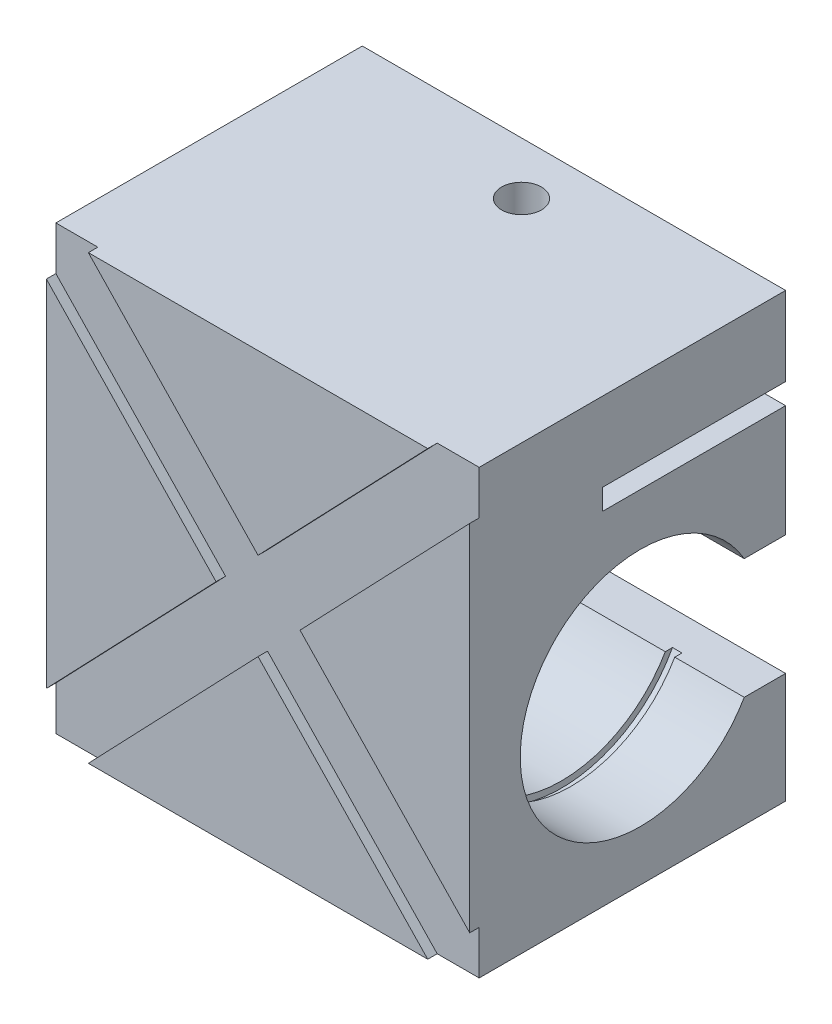
ISO-10303-21;
HEADER;
FILE_DESCRIPTION(('STEP AP214'),'2;1');
FILE_NAME('part.step','',(''),(''),'','','');
FILE_SCHEMA(('AUTOMOTIVE_DESIGN { 1 0 10303 214 1 1 1 1 }'));
ENDSEC;
DATA;
#1=APPLICATION_CONTEXT('core data for automotive mechanical design processes');
#2=APPLICATION_PROTOCOL_DEFINITION('international standard','automotive_design',2000,#1);
#3=PRODUCT_CONTEXT('',#1,'mechanical');
#4=PRODUCT('Part','Part','',(#3));
#5=PRODUCT_RELATED_PRODUCT_CATEGORY('part','',(#4));
#6=PRODUCT_DEFINITION_FORMATION('','',#4);
#7=PRODUCT_DEFINITION_CONTEXT('part definition',#1,'design');
#8=PRODUCT_DEFINITION('design','',#6,#7);
#9=PRODUCT_DEFINITION_SHAPE('','',#8);
#10=(LENGTH_UNIT() NAMED_UNIT(*) SI_UNIT(.MILLI.,.METRE.));
#11=(NAMED_UNIT(*) PLANE_ANGLE_UNIT() SI_UNIT($,.RADIAN.));
#12=(NAMED_UNIT(*) SI_UNIT($,.STERADIAN.) SOLID_ANGLE_UNIT());
#13=UNCERTAINTY_MEASURE_WITH_UNIT(LENGTH_MEASURE(1.E-05),#10,'distance_accuracy_value','');
#14=(GEOMETRIC_REPRESENTATION_CONTEXT(3) GLOBAL_UNCERTAINTY_ASSIGNED_CONTEXT((#13)) GLOBAL_UNIT_ASSIGNED_CONTEXT((#10,
#11,#12)) REPRESENTATION_CONTEXT('',''));
#15=CARTESIAN_POINT('',(0.,0.,0.));
#16=DIRECTION('',(0.,0.,1.));
#17=DIRECTION('',(1.,0.,0.));
#18=AXIS2_PLACEMENT_3D('',#15,#16,#17);
#19=CARTESIAN_POINT('',(-33.5,70.,25.));
#20=DIRECTION('',(0.,0.,-1.));
#21=DIRECTION('',(-1.,0.,0.));
#22=AXIS2_PLACEMENT_3D('',#19,#20,#21);
#23=PLANE('',#22);
#24=DIRECTION('',(0.,-1.,0.));
#25=VECTOR('',#24,1.);
#26=CARTESIAN_POINT('',(-33.5,70.,25.));
#27=LINE('',#26,#25);
#28=CARTESIAN_POINT('',(-33.5,63.0581359493212,25.));
#29=VERTEX_POINT('',#28);
#30=CARTESIAN_POINT('',(-33.5,6.94186405067878,25.));
#31=VERTEX_POINT('',#30);
#32=EDGE_CURVE('E529',#29,#31,#27,.T.);
#33=ORIENTED_EDGE('',*,*,#32,.T.);
#34=DIRECTION('',(-0.691456929285535,-0.722417687313246,0.));
#35=VECTOR('',#34,1.);
#36=CARTESIAN_POINT('',(-36.9676048991036,3.31899326057057,25.));
#37=LINE('',#36,#35);
#38=CARTESIAN_POINT('',(-6.64435559136398,35.,25.));
#39=VERTEX_POINT('',#38);
#40=EDGE_CURVE('E258',#39,#31,#37,.T.);
#41=ORIENTED_EDGE('',*,*,#40,.F.);
#42=DIRECTION('',(0.691456929285535,-0.722417687313246,0.));
#43=VECTOR('',#42,1.);
#44=CARTESIAN_POINT('',(-36.9676048991036,66.6810067394294,25.));
#45=LINE('',#44,#43);
#46=EDGE_CURVE('E315',#29,#39,#45,.T.);
#47=ORIENTED_EDGE('',*,*,#46,.F.);
#48=EDGE_LOOP('',(#33,#41,#47));
#49=FACE_BOUND('',#48,.T.);
#50=ADVANCED_FACE('F43',(#49),#23,.F.);
#51=DIRECTION('',(1.,0.,0.));
#52=VECTOR('',#51,1.);
#53=CARTESIAN_POINT('',(-33.5,70.,25.));
#54=LINE('',#53,#52);
#55=CARTESIAN_POINT('',(-26.855644408636,70.,25.));
#56=VERTEX_POINT('',#55);
#57=CARTESIAN_POINT('',(26.855644408636,70.,25.));
#58=VERTEX_POINT('',#57);
#59=EDGE_CURVE('E508',#56,#58,#54,.T.);
#60=ORIENTED_EDGE('',*,*,#59,.F.);
#61=DIRECTION('',(-0.691456929285535,0.722417687313246,0.));
#62=VECTOR('',#61,1.);
#63=CARTESIAN_POINT('',(-30.0323951008964,73.3189932605706,25.));
#64=LINE('',#63,#62);
#65=CARTESIAN_POINT('',(0.,41.9418640506788,25.));
#66=VERTEX_POINT('',#65);
#67=EDGE_CURVE('E312',#66,#56,#64,.T.);
#68=ORIENTED_EDGE('',*,*,#67,.F.);
#69=DIRECTION('',(-0.691456929285535,-0.722417687313246,0.));
#70=VECTOR('',#69,1.);
#71=CARTESIAN_POINT('',(0.,41.9418640506788,25.));
#72=LINE('',#71,#70);
#73=EDGE_CURVE('E309',#58,#66,#72,.T.);
#74=ORIENTED_EDGE('',*,*,#73,.F.);
#75=EDGE_LOOP('',(#60,#68,#74));
#76=FACE_BOUND('',#75,.T.);
#77=ADVANCED_FACE('F586',(#76),#23,.F.);
#78=DIRECTION('',(0.,-1.,0.));
#79=VECTOR('',#78,1.);
#80=CARTESIAN_POINT('',(33.5,70.,25.));
#81=LINE('',#80,#79);
#82=CARTESIAN_POINT('',(33.5,63.0581359493212,25.));
#83=VERTEX_POINT('',#82);
#84=CARTESIAN_POINT('',(33.5,6.94186405067878,25.));
#85=VERTEX_POINT('',#84);
#86=EDGE_CURVE('E512',#83,#85,#81,.T.);
#87=ORIENTED_EDGE('',*,*,#86,.F.);
#88=DIRECTION('',(0.691456929285535,0.722417687313246,0.));
#89=VECTOR('',#88,1.);
#90=CARTESIAN_POINT('',(6.64435559136398,35.,25.));
#91=LINE('',#90,#89);
#92=CARTESIAN_POINT('',(6.64435559136398,35.,25.));
#93=VERTEX_POINT('',#92);
#94=EDGE_CURVE('E306',#93,#83,#91,.T.);
#95=ORIENTED_EDGE('',*,*,#94,.F.);
#96=DIRECTION('',(-0.691456929285535,0.722417687313246,0.));
#97=VECTOR('',#96,1.);
#98=CARTESIAN_POINT('',(6.64435559136398,35.,25.));
#99=LINE('',#98,#97);
#100=EDGE_CURVE('E303',#85,#93,#99,.T.);
#101=ORIENTED_EDGE('',*,*,#100,.F.);
#102=EDGE_LOOP('',(#87,#95,#101));
#103=FACE_BOUND('',#102,.T.);
#104=ADVANCED_FACE('F668',(#103),#23,.F.);
#105=CARTESIAN_POINT('',(-33.5,27.,-1.99999999999999));
#106=DIRECTION('',(1.,0.,0.));
#107=DIRECTION('',(0.,0.,-1.));
#108=AXIS2_PLACEMENT_3D('',#105,#106,#107);
#109=CYLINDRICAL_SURFACE('',#108,19.);
#110=CARTESIAN_POINT('',(-21.,27.,-1.99999999999999));
#111=DIRECTION('',(-1.,0.,0.));
#112=DIRECTION('',(0.,0.,1.));
#113=AXIS2_PLACEMENT_3D('',#110,#111,#112);
#114=CIRCLE('',#113,19.);
#115=CARTESIAN_POINT('',(-21.,36.5,-18.4544826719043));
#116=VERTEX_POINT('',#115);
#117=CARTESIAN_POINT('',(-21.,17.5,-18.4544826719043));
#118=VERTEX_POINT('',#117);
#119=EDGE_CURVE('E67',#116,#118,#114,.F.);
#120=ORIENTED_EDGE('',*,*,#119,.F.);
#121=DIRECTION('',(1.,0.,0.));
#122=VECTOR('',#121,1.);
#123=CARTESIAN_POINT('',(-33.5,36.5,-18.4544826719043));
#124=LINE('',#123,#122);
#125=CARTESIAN_POINT('',(21.,36.5,-18.4544826719043));
#126=VERTEX_POINT('',#125);
#127=EDGE_CURVE('E475',#116,#126,#124,.T.);
#128=ORIENTED_EDGE('',*,*,#127,.T.);
#129=CARTESIAN_POINT('',(21.,27.,-1.99999999999999));
#130=DIRECTION('',(1.,0.,0.));
#131=DIRECTION('',(0.,0.,-1.));
#132=AXIS2_PLACEMENT_3D('',#129,#130,#131);
#133=CIRCLE('',#132,19.);
#134=CARTESIAN_POINT('',(21.,17.5,-18.4544826719043));
#135=VERTEX_POINT('',#134);
#136=EDGE_CURVE('E398',#135,#126,#133,.F.);
#137=ORIENTED_EDGE('',*,*,#136,.F.);
#138=DIRECTION('',(1.,0.,0.));
#139=VECTOR('',#138,1.);
#140=CARTESIAN_POINT('',(-33.5,17.5,-18.4544826719043));
#141=LINE('',#140,#139);
#142=EDGE_CURVE('E462',#118,#135,#141,.T.);
#143=ORIENTED_EDGE('',*,*,#142,.F.);
#144=EDGE_LOOP('',(#120,#128,#137,#143));
#145=FACE_BOUND('',#144,.T.);
#146=ADVANCED_FACE('F681',(#145),#109,.F.);
#147=CARTESIAN_POINT('',(-33.5,36.5,-18.4544826719043));
#148=VERTEX_POINT('',#147);
#149=CARTESIAN_POINT('',(-22.5,36.5,-18.4544826719043));
#150=VERTEX_POINT('',#149);
#151=EDGE_CURVE('E471',#148,#150,#124,.T.);
#152=ORIENTED_EDGE('',*,*,#151,.T.);
#153=CARTESIAN_POINT('',(-22.5,27.,-1.99999999999999));
#154=DIRECTION('',(-1.,0.,0.));
#155=DIRECTION('',(0.,0.,1.));
#156=AXIS2_PLACEMENT_3D('',#153,#154,#155);
#157=CIRCLE('',#156,19.);
#158=CARTESIAN_POINT('',(-22.5,17.5,-18.4544826719043));
#159=VERTEX_POINT('',#158);
#160=EDGE_CURVE('E381',#150,#159,#157,.F.);
#161=ORIENTED_EDGE('',*,*,#160,.T.);
#162=CARTESIAN_POINT('',(-33.5,17.5,-18.4544826719043));
#163=VERTEX_POINT('',#162);
#164=EDGE_CURVE('E457',#163,#159,#141,.T.);
#165=ORIENTED_EDGE('',*,*,#164,.F.);
#166=CARTESIAN_POINT('',(-33.5,27.,-1.99999999999999));
#167=DIRECTION('',(1.,0.,0.));
#168=DIRECTION('',(0.,0.,-1.));
#169=AXIS2_PLACEMENT_3D('',#166,#167,#168);
#170=CIRCLE('',#169,19.);
#171=EDGE_CURVE('E481',#148,#163,#170,.T.);
#172=ORIENTED_EDGE('',*,*,#171,.F.);
#173=EDGE_LOOP('',(#152,#161,#165,#172));
#174=FACE_BOUND('',#173,.T.);
#175=ADVANCED_FACE('F686',(#174),#109,.F.);
#176=CARTESIAN_POINT('',(-33.5,70.,-25.));
#177=DIRECTION('',(0.,0.,1.));
#178=DIRECTION('',(1.,0.,0.));
#179=AXIS2_PLACEMENT_3D('',#176,#177,#178);
#180=PLANE('',#179);
#181=DIRECTION('',(0.,-1.,0.));
#182=VECTOR('',#181,1.);
#183=CARTESIAN_POINT('',(-33.5,70.,-25.));
#184=LINE('',#183,#182);
#185=CARTESIAN_POINT('',(-33.5,54.2,-25.));
#186=VERTEX_POINT('',#185);
#187=CARTESIAN_POINT('',(-33.5,36.5,-25.));
#188=VERTEX_POINT('',#187);
#189=EDGE_CURVE('E539',#186,#188,#184,.T.);
#190=ORIENTED_EDGE('',*,*,#189,.F.);
#191=DIRECTION('',(1.,0.,0.));
#192=VECTOR('',#191,1.);
#193=CARTESIAN_POINT('',(-33.5,54.2,-25.));
#194=LINE('',#193,#192);
#195=CARTESIAN_POINT('',(33.5,54.2,-25.));
#196=VERTEX_POINT('',#195);
#197=EDGE_CURVE('E432',#186,#196,#194,.T.);
#198=ORIENTED_EDGE('',*,*,#197,.T.);
#199=DIRECTION('',(0.,-1.,0.));
#200=VECTOR('',#199,1.);
#201=CARTESIAN_POINT('',(33.5,70.,-25.));
#202=LINE('',#201,#200);
#203=CARTESIAN_POINT('',(33.5,36.5,-25.));
#204=VERTEX_POINT('',#203);
#205=EDGE_CURVE('E545',#196,#204,#202,.T.);
#206=ORIENTED_EDGE('',*,*,#205,.T.);
#207=DIRECTION('',(1.,0.,0.));
#208=VECTOR('',#207,1.);
#209=CARTESIAN_POINT('',(-33.5,36.5,-25.));
#210=LINE('',#209,#208);
#211=EDGE_CURVE('E468',#188,#204,#210,.T.);
#212=ORIENTED_EDGE('',*,*,#211,.F.);
#213=EDGE_LOOP('',(#190,#198,#206,#212));
#214=FACE_BOUND('',#213,.T.);
#215=ADVANCED_FACE('F630',(#214),#180,.F.);
#216=CARTESIAN_POINT('',(33.5,70.,-25.));
#217=VERTEX_POINT('',#216);
#218=CARTESIAN_POINT('',(33.5,57.5,-25.));
#219=VERTEX_POINT('',#218);
#220=EDGE_CURVE('E540',#217,#219,#202,.T.);
#221=ORIENTED_EDGE('',*,*,#220,.T.);
#222=DIRECTION('',(1.,0.,0.));
#223=VECTOR('',#222,1.);
#224=CARTESIAN_POINT('',(-33.5,57.5,-25.));
#225=LINE('',#224,#223);
#226=CARTESIAN_POINT('',(-33.5,57.5,-25.));
#227=VERTEX_POINT('',#226);
#228=EDGE_CURVE('E451',#227,#219,#225,.T.);
#229=ORIENTED_EDGE('',*,*,#228,.F.);
#230=CARTESIAN_POINT('',(-33.5,70.,-25.));
#231=VERTEX_POINT('',#230);
#232=EDGE_CURVE('E534',#231,#227,#184,.T.);
#233=ORIENTED_EDGE('',*,*,#232,.F.);
#234=DIRECTION('',(-1.,0.,0.));
#235=VECTOR('',#234,1.);
#236=CARTESIAN_POINT('',(-33.5,70.,-25.));
#237=LINE('',#236,#235);
#238=EDGE_CURVE('E500',#217,#231,#237,.T.);
#239=ORIENTED_EDGE('',*,*,#238,.F.);
#240=EDGE_LOOP('',(#221,#229,#233,#239));
#241=FACE_BOUND('',#240,.T.);
#242=ADVANCED_FACE('F604',(#241),#180,.F.);
#243=CARTESIAN_POINT('',(33.5,70.,-25.));
#244=DIRECTION('',(-1.,0.,0.));
#245=DIRECTION('',(0.,0.,1.));
#246=AXIS2_PLACEMENT_3D('',#243,#244,#245);
#247=PLANE('',#246);
#248=ORIENTED_EDGE('',*,*,#86,.T.);
#249=DIRECTION('',(0.,0.,-1.));
#250=VECTOR('',#249,1.);
#251=CARTESIAN_POINT('',(33.5,6.94186405067879,-25.));
#252=LINE('',#251,#250);
#253=CARTESIAN_POINT('',(33.5,6.94186405067878,23.5));
#254=VERTEX_POINT('',#253);
#255=EDGE_CURVE('E344',#85,#254,#252,.T.);
#256=ORIENTED_EDGE('',*,*,#255,.T.);
#257=DIRECTION('',(0.,1.,0.));
#258=VECTOR('',#257,1.);
#259=CARTESIAN_POINT('',(33.5,70.,23.5));
#260=LINE('',#259,#258);
#261=CARTESIAN_POINT('',(33.4999999999999,0.,23.5));
#262=VERTEX_POINT('',#261);
#263=EDGE_CURVE('E324',#262,#254,#260,.T.);
#264=ORIENTED_EDGE('',*,*,#263,.F.);
#265=DIRECTION('',(0.,0.,-1.));
#266=VECTOR('',#265,1.);
#267=CARTESIAN_POINT('',(33.5,0.,-25.));
#268=LINE('',#267,#266);
#269=CARTESIAN_POINT('',(33.5,0.,-25.));
#270=VERTEX_POINT('',#269);
#271=EDGE_CURVE('E447',#262,#270,#268,.T.);
#272=ORIENTED_EDGE('',*,*,#271,.T.);
#273=CARTESIAN_POINT('',(33.5,17.5,-25.));
#274=VERTEX_POINT('',#273);
#275=EDGE_CURVE('E538',#274,#270,#202,.T.);
#276=ORIENTED_EDGE('',*,*,#275,.F.);
#277=DIRECTION('',(0.,0.,-1.));
#278=VECTOR('',#277,1.);
#279=CARTESIAN_POINT('',(33.5,17.5,-25.));
#280=LINE('',#279,#278);
#281=CARTESIAN_POINT('',(33.5,17.5,-18.4544826719043));
#282=VERTEX_POINT('',#281);
#283=EDGE_CURVE('E480',#282,#274,#280,.T.);
#284=ORIENTED_EDGE('',*,*,#283,.F.);
#285=CARTESIAN_POINT('',(33.5,27.,-1.99999999999999));
#286=DIRECTION('',(1.,0.,0.));
#287=DIRECTION('',(0.,0.,-1.));
#288=AXIS2_PLACEMENT_3D('',#285,#286,#287);
#289=CIRCLE('',#288,19.);
#290=CARTESIAN_POINT('',(33.5,36.5,-18.4544826719043));
#291=VERTEX_POINT('',#290);
#292=EDGE_CURVE('E437',#291,#282,#289,.T.);
#293=ORIENTED_EDGE('',*,*,#292,.F.);
#294=DIRECTION('',(0.,0.,1.));
#295=VECTOR('',#294,1.);
#296=CARTESIAN_POINT('',(33.5,36.5,-25.));
#297=LINE('',#296,#295);
#298=EDGE_CURVE('E476',#204,#291,#297,.T.);
#299=ORIENTED_EDGE('',*,*,#298,.F.);
#300=ORIENTED_EDGE('',*,*,#205,.F.);
#301=DIRECTION('',(0.,0.,-1.));
#302=VECTOR('',#301,1.);
#303=CARTESIAN_POINT('',(33.5,54.2,-25.));
#304=LINE('',#303,#302);
#305=CARTESIAN_POINT('',(33.5,54.2,4.));
#306=VERTEX_POINT('',#305);
#307=EDGE_CURVE('E433',#306,#196,#304,.T.);
#308=ORIENTED_EDGE('',*,*,#307,.F.);
#309=DIRECTION('',(0.,-1.,0.));
#310=VECTOR('',#309,1.);
#311=CARTESIAN_POINT('',(33.5,54.2,4.));
#312=LINE('',#311,#310);
#313=CARTESIAN_POINT('',(33.5,57.5,4.));
#314=VERTEX_POINT('',#313);
#315=EDGE_CURVE('E424',#314,#306,#312,.T.);
#316=ORIENTED_EDGE('',*,*,#315,.F.);
#317=DIRECTION('',(0.,0.,1.));
#318=VECTOR('',#317,1.);
#319=CARTESIAN_POINT('',(33.5,57.5,4.));
#320=LINE('',#319,#318);
#321=EDGE_CURVE('E436',#219,#314,#320,.T.);
#322=ORIENTED_EDGE('',*,*,#321,.F.);
#323=ORIENTED_EDGE('',*,*,#220,.F.);
#324=DIRECTION('',(0.,0.,-1.));
#325=VECTOR('',#324,1.);
#326=CARTESIAN_POINT('',(33.5,70.,-25.));
#327=LINE('',#326,#325);
#328=CARTESIAN_POINT('',(33.4999999999999,70.,23.5));
#329=VERTEX_POINT('',#328);
#330=EDGE_CURVE('E497',#329,#217,#327,.T.);
#331=ORIENTED_EDGE('',*,*,#330,.F.);
#332=CARTESIAN_POINT('',(33.5,63.0581359493212,23.5));
#333=VERTEX_POINT('',#332);
#334=EDGE_CURVE('E335',#333,#329,#260,.T.);
#335=ORIENTED_EDGE('',*,*,#334,.F.);
#336=DIRECTION('',(0.,0.,1.));
#337=VECTOR('',#336,1.);
#338=CARTESIAN_POINT('',(33.5,63.0581359493212,-25.));
#339=LINE('',#338,#337);
#340=EDGE_CURVE('E348',#333,#83,#339,.T.);
#341=ORIENTED_EDGE('',*,*,#340,.T.);
#342=EDGE_LOOP('',(#248,#256,#264,#272,#276,#284,#293,#299,#300,#308,#316,#322,#323,#331,#335,#341));
#343=FACE_BOUND('',#342,.T.);
#344=ADVANCED_FACE('F45',(#343),#247,.F.);
#345=CARTESIAN_POINT('',(-33.5,17.5,-25.));
#346=VERTEX_POINT('',#345);
#347=CARTESIAN_POINT('',(-33.5,0.,-25.));
#348=VERTEX_POINT('',#347);
#349=EDGE_CURVE('E533',#346,#348,#184,.T.);
#350=ORIENTED_EDGE('',*,*,#349,.F.);
#351=DIRECTION('',(1.,0.,0.));
#352=VECTOR('',#351,1.);
#353=CARTESIAN_POINT('',(-33.5,17.5,-25.));
#354=LINE('',#353,#352);
#355=EDGE_CURVE('E464',#346,#274,#354,.T.);
#356=ORIENTED_EDGE('',*,*,#355,.T.);
#357=ORIENTED_EDGE('',*,*,#275,.T.);
#358=DIRECTION('',(-1.,0.,0.));
#359=VECTOR('',#358,1.);
#360=CARTESIAN_POINT('',(-33.5,0.,-25.));
#361=LINE('',#360,#359);
#362=EDGE_CURVE('E515',#270,#348,#361,.T.);
#363=ORIENTED_EDGE('',*,*,#362,.T.);
#364=EDGE_LOOP('',(#350,#356,#357,#363));
#365=FACE_BOUND('',#364,.T.);
#366=ADVANCED_FACE('F679',(#365),#180,.F.);
#367=CARTESIAN_POINT('',(-33.5,70.,-25.));
#368=DIRECTION('',(1.,0.,0.));
#369=DIRECTION('',(0.,0.,-1.));
#370=AXIS2_PLACEMENT_3D('',#367,#368,#369);
#371=PLANE('',#370);
#372=ORIENTED_EDGE('',*,*,#32,.F.);
#373=DIRECTION('',(0.,0.,-1.));
#374=VECTOR('',#373,1.);
#375=CARTESIAN_POINT('',(-33.5,63.0581359493212,-25.));
#376=LINE('',#375,#374);
#377=CARTESIAN_POINT('',(-33.5,63.0581359493212,23.5));
#378=VERTEX_POINT('',#377);
#379=EDGE_CURVE('E352',#29,#378,#376,.T.);
#380=ORIENTED_EDGE('',*,*,#379,.T.);
#381=DIRECTION('',(0.,-1.,0.));
#382=VECTOR('',#381,1.);
#383=CARTESIAN_POINT('',(-33.5,70.,23.5));
#384=LINE('',#383,#382);
#385=CARTESIAN_POINT('',(-33.5,70.,23.5));
#386=VERTEX_POINT('',#385);
#387=EDGE_CURVE('E339',#386,#378,#384,.T.);
#388=ORIENTED_EDGE('',*,*,#387,.F.);
#389=DIRECTION('',(0.,0.,1.));
#390=VECTOR('',#389,1.);
#391=CARTESIAN_POINT('',(-33.5,70.,-25.));
#392=LINE('',#391,#390);
#393=EDGE_CURVE('E504',#231,#386,#392,.T.);
#394=ORIENTED_EDGE('',*,*,#393,.F.);
#395=ORIENTED_EDGE('',*,*,#232,.T.);
#396=DIRECTION('',(0.,0.,1.));
#397=VECTOR('',#396,1.);
#398=CARTESIAN_POINT('',(-33.5,57.5,4.));
#399=LINE('',#398,#397);
#400=CARTESIAN_POINT('',(-33.5,57.5,4.));
#401=VERTEX_POINT('',#400);
#402=EDGE_CURVE('E423',#227,#401,#399,.T.);
#403=ORIENTED_EDGE('',*,*,#402,.T.);
#404=DIRECTION('',(0.,-1.,0.));
#405=VECTOR('',#404,1.);
#406=CARTESIAN_POINT('',(-33.5,54.2,4.));
#407=LINE('',#406,#405);
#408=CARTESIAN_POINT('',(-33.5,54.2,4.));
#409=VERTEX_POINT('',#408);
#410=EDGE_CURVE('E428',#401,#409,#407,.T.);
#411=ORIENTED_EDGE('',*,*,#410,.T.);
#412=DIRECTION('',(0.,0.,-1.));
#413=VECTOR('',#412,1.);
#414=CARTESIAN_POINT('',(-33.5,54.2,-25.));
#415=LINE('',#414,#413);
#416=EDGE_CURVE('E419',#409,#186,#415,.T.);
#417=ORIENTED_EDGE('',*,*,#416,.T.);
#418=ORIENTED_EDGE('',*,*,#189,.T.);
#419=DIRECTION('',(0.,0.,1.));
#420=VECTOR('',#419,1.);
#421=CARTESIAN_POINT('',(-33.5,36.5,-25.));
#422=LINE('',#421,#420);
#423=EDGE_CURVE('E461',#188,#148,#422,.T.);
#424=ORIENTED_EDGE('',*,*,#423,.T.);
#425=ORIENTED_EDGE('',*,*,#171,.T.);
#426=DIRECTION('',(0.,0.,-1.));
#427=VECTOR('',#426,1.);
#428=CARTESIAN_POINT('',(-33.5,17.5,-25.));
#429=LINE('',#428,#427);
#430=EDGE_CURVE('E490',#163,#346,#429,.T.);
#431=ORIENTED_EDGE('',*,*,#430,.T.);
#432=ORIENTED_EDGE('',*,*,#349,.T.);
#433=DIRECTION('',(0.,0.,1.));
#434=VECTOR('',#433,1.);
#435=CARTESIAN_POINT('',(-33.5,0.,-25.));
#436=LINE('',#435,#434);
#437=CARTESIAN_POINT('',(-33.5,0.,23.5));
#438=VERTEX_POINT('',#437);
#439=EDGE_CURVE('E519',#348,#438,#436,.T.);
#440=ORIENTED_EDGE('',*,*,#439,.T.);
#441=CARTESIAN_POINT('',(-33.5,6.94186405067878,23.5));
#442=VERTEX_POINT('',#441);
#443=EDGE_CURVE('E334',#442,#438,#384,.T.);
#444=ORIENTED_EDGE('',*,*,#443,.F.);
#445=DIRECTION('',(0.,0.,1.));
#446=VECTOR('',#445,1.);
#447=CARTESIAN_POINT('',(-33.5,6.94186405067879,-25.));
#448=LINE('',#447,#446);
#449=EDGE_CURVE('E356',#442,#31,#448,.T.);
#450=ORIENTED_EDGE('',*,*,#449,.T.);
#451=EDGE_LOOP('',(#372,#380,#388,#394,#395,#403,#411,#417,#418,#424,#425,#431,#432,#440,#444,#450));
#452=FACE_BOUND('',#451,.T.);
#453=ADVANCED_FACE('F609',(#452),#371,.F.);
#454=DIRECTION('',(1.,0.,0.));
#455=VECTOR('',#454,1.);
#456=CARTESIAN_POINT('',(-33.5,0.,25.));
#457=LINE('',#456,#455);
#458=CARTESIAN_POINT('',(-26.855644408636,0.,25.));
#459=VERTEX_POINT('',#458);
#460=CARTESIAN_POINT('',(26.855644408636,0.,25.));
#461=VERTEX_POINT('',#460);
#462=EDGE_CURVE('E501',#459,#461,#457,.T.);
#463=ORIENTED_EDGE('',*,*,#462,.T.);
#464=DIRECTION('',(0.691456929285535,-0.722417687313246,0.));
#465=VECTOR('',#464,1.);
#466=CARTESIAN_POINT('',(0.,28.0581359493212,25.));
#467=LINE('',#466,#465);
#468=CARTESIAN_POINT('',(0.,28.0581359493212,25.));
#469=VERTEX_POINT('',#468);
#470=EDGE_CURVE('E300',#469,#461,#467,.T.);
#471=ORIENTED_EDGE('',*,*,#470,.F.);
#472=DIRECTION('',(0.691456929285535,0.722417687313246,0.));
#473=VECTOR('',#472,1.);
#474=CARTESIAN_POINT('',(-30.0323951008964,-3.31899326057057,25.));
#475=LINE('',#474,#473);
#476=EDGE_CURVE('E264',#459,#469,#475,.T.);
#477=ORIENTED_EDGE('',*,*,#476,.F.);
#478=EDGE_LOOP('',(#463,#471,#477));
#479=FACE_BOUND('',#478,.T.);
#480=ADVANCED_FACE('F664',(#479),#23,.F.);
#481=CARTESIAN_POINT('',(0.,70.,0.));
#482=DIRECTION('',(0.,1.,0.));
#483=DIRECTION('',(0.,0.,1.));
#484=AXIS2_PLACEMENT_3D('',#481,#482,#483);
#485=PLANE('',#484);
#486=DIRECTION('',(0.,0.,-1.));
#487=VECTOR('',#486,1.);
#488=CARTESIAN_POINT('',(-26.855644408636,70.,0.));
#489=LINE('',#488,#487);
#490=CARTESIAN_POINT('',(-26.855644408636,70.,23.5));
#491=VERTEX_POINT('',#490);
#492=EDGE_CURVE('E11',#56,#491,#489,.T.);
#493=ORIENTED_EDGE('',*,*,#492,.F.);
#494=ORIENTED_EDGE('',*,*,#59,.T.);
#495=DIRECTION('',(0.,0.,1.));
#496=VECTOR('',#495,1.);
#497=CARTESIAN_POINT('',(26.855644408636,70.,0.));
#498=LINE('',#497,#496);
#499=CARTESIAN_POINT('',(26.855644408636,70.,23.5));
#500=VERTEX_POINT('',#499);
#501=EDGE_CURVE('E52',#500,#58,#498,.T.);
#502=ORIENTED_EDGE('',*,*,#501,.F.);
#503=DIRECTION('',(1.,0.,0.));
#504=VECTOR('',#503,1.);
#505=CARTESIAN_POINT('',(0.,70.,23.5));
#506=LINE('',#505,#504);
#507=EDGE_CURVE('E338',#500,#329,#506,.T.);
#508=ORIENTED_EDGE('',*,*,#507,.T.);
#509=ORIENTED_EDGE('',*,*,#330,.T.);
#510=ORIENTED_EDGE('',*,*,#238,.T.);
#511=ORIENTED_EDGE('',*,*,#393,.T.);
#512=EDGE_CURVE('E343',#386,#491,#506,.T.);
#513=ORIENTED_EDGE('',*,*,#512,.T.);
#514=EDGE_LOOP('',(#493,#494,#502,#508,#509,#510,#511,#513));
#515=FACE_BOUND('',#514,.T.);
#516=CARTESIAN_POINT('',(0.,70.,-16.7));
#517=DIRECTION('',(0.,1.,0.));
#518=DIRECTION('',(0.,0.,1.));
#519=AXIS2_PLACEMENT_3D('',#516,#517,#518);
#520=CIRCLE('',#519,3.15);
#521=CARTESIAN_POINT('',(0.,70.,-13.55));
#522=VERTEX_POINT('',#521);
#523=EDGE_CURVE('E364',#522,#522,#520,.T.);
#524=ORIENTED_EDGE('',*,*,#523,.F.);
#525=EDGE_LOOP('',(#524));
#526=FACE_BOUND('',#525,.T.);
#527=ADVANCED_FACE('F588',(#515,#526),#485,.T.);
#528=CARTESIAN_POINT('',(0.,0.,0.));
#529=DIRECTION('',(0.,1.,0.));
#530=DIRECTION('',(0.,0.,1.));
#531=AXIS2_PLACEMENT_3D('',#528,#529,#530);
#532=PLANE('',#531);
#533=ORIENTED_EDGE('',*,*,#462,.F.);
#534=DIRECTION('',(0.,0.,-1.));
#535=VECTOR('',#534,1.);
#536=CARTESIAN_POINT('',(-26.855644408636,0.,0.));
#537=LINE('',#536,#535);
#538=CARTESIAN_POINT('',(-26.855644408636,0.,23.5));
#539=VERTEX_POINT('',#538);
#540=EDGE_CURVE('E573',#459,#539,#537,.T.);
#541=ORIENTED_EDGE('',*,*,#540,.T.);
#542=DIRECTION('',(1.,0.,0.));
#543=VECTOR('',#542,1.);
#544=CARTESIAN_POINT('',(0.,0.,23.5));
#545=LINE('',#544,#543);
#546=EDGE_CURVE('E254',#438,#539,#545,.T.);
#547=ORIENTED_EDGE('',*,*,#546,.F.);
#548=ORIENTED_EDGE('',*,*,#439,.F.);
#549=ORIENTED_EDGE('',*,*,#362,.F.);
#550=ORIENTED_EDGE('',*,*,#271,.F.);
#551=CARTESIAN_POINT('',(26.855644408636,0.,23.5));
#552=VERTEX_POINT('',#551);
#553=EDGE_CURVE('E568',#552,#262,#545,.T.);
#554=ORIENTED_EDGE('',*,*,#553,.F.);
#555=DIRECTION('',(0.,0.,1.));
#556=VECTOR('',#555,1.);
#557=CARTESIAN_POINT('',(26.855644408636,0.,0.));
#558=LINE('',#557,#556);
#559=EDGE_CURVE('E273',#552,#461,#558,.T.);
#560=ORIENTED_EDGE('',*,*,#559,.T.);
#561=EDGE_LOOP('',(#533,#541,#547,#548,#549,#550,#554,#560));
#562=FACE_BOUND('',#561,.T.);
#563=ADVANCED_FACE('F677',(#562),#532,.F.);
#564=CARTESIAN_POINT('',(22.5,17.5,-18.4544826719043));
#565=VERTEX_POINT('',#564);
#566=EDGE_CURVE('E463',#565,#282,#141,.T.);
#567=ORIENTED_EDGE('',*,*,#566,.F.);
#568=CARTESIAN_POINT('',(22.5,27.,-1.99999999999999));
#569=DIRECTION('',(1.,0.,0.));
#570=DIRECTION('',(0.,0.,-1.));
#571=AXIS2_PLACEMENT_3D('',#568,#569,#570);
#572=CIRCLE('',#571,19.);
#573=CARTESIAN_POINT('',(22.5,36.5,-18.4544826719043));
#574=VERTEX_POINT('',#573);
#575=EDGE_CURVE('E407',#565,#574,#572,.F.);
#576=ORIENTED_EDGE('',*,*,#575,.T.);
#577=EDGE_CURVE('E418',#574,#291,#124,.T.);
#578=ORIENTED_EDGE('',*,*,#577,.T.);
#579=ORIENTED_EDGE('',*,*,#292,.T.);
#580=EDGE_LOOP('',(#567,#576,#578,#579));
#581=FACE_BOUND('',#580,.T.);
#582=ADVANCED_FACE('F689',(#581),#109,.F.);
#583=CARTESIAN_POINT('',(-33.5,36.5,-25.));
#584=DIRECTION('',(0.,1.,0.));
#585=DIRECTION('',(0.,0.,1.));
#586=AXIS2_PLACEMENT_3D('',#583,#584,#585);
#587=PLANE('',#586);
#588=DIRECTION('',(1.,0.,0.));
#589=VECTOR('',#588,1.);
#590=CARTESIAN_POINT('',(-22.5,36.5,-19.599715906798));
#591=LINE('',#590,#589);
#592=CARTESIAN_POINT('',(-21.,36.5,-19.599715906798));
#593=VERTEX_POINT('',#592);
#594=CARTESIAN_POINT('',(-22.5,36.5,-19.599715906798));
#595=VERTEX_POINT('',#594);
#596=EDGE_CURVE('E389',#593,#595,#591,.F.);
#597=ORIENTED_EDGE('',*,*,#596,.T.);
#598=DIRECTION('',(0.,0.,1.));
#599=VECTOR('',#598,1.);
#600=CARTESIAN_POINT('',(-22.5,36.5,-25.));
#601=LINE('',#600,#599);
#602=EDGE_CURVE('E385',#595,#150,#601,.T.);
#603=ORIENTED_EDGE('',*,*,#602,.T.);
#604=ORIENTED_EDGE('',*,*,#151,.F.);
#605=ORIENTED_EDGE('',*,*,#423,.F.);
#606=ORIENTED_EDGE('',*,*,#211,.T.);
#607=ORIENTED_EDGE('',*,*,#298,.T.);
#608=ORIENTED_EDGE('',*,*,#577,.F.);
#609=DIRECTION('',(0.,0.,-1.));
#610=VECTOR('',#609,1.);
#611=CARTESIAN_POINT('',(22.5,36.5,-25.));
#612=LINE('',#611,#610);
#613=CARTESIAN_POINT('',(22.5,36.5,-19.599715906798));
#614=VERTEX_POINT('',#613);
#615=EDGE_CURVE('E411',#574,#614,#612,.T.);
#616=ORIENTED_EDGE('',*,*,#615,.T.);
#617=DIRECTION('',(-1.,0.,0.));
#618=VECTOR('',#617,1.);
#619=CARTESIAN_POINT('',(22.5,36.5,-19.599715906798));
#620=LINE('',#619,#618);
#621=CARTESIAN_POINT('',(21.,36.5,-19.599715906798));
#622=VERTEX_POINT('',#621);
#623=EDGE_CURVE('E415',#622,#614,#620,.F.);
#624=ORIENTED_EDGE('',*,*,#623,.F.);
#625=DIRECTION('',(0.,0.,-1.));
#626=VECTOR('',#625,1.);
#627=CARTESIAN_POINT('',(21.,36.5,-25.));
#628=LINE('',#627,#626);
#629=EDGE_CURVE('E404',#126,#622,#628,.T.);
#630=ORIENTED_EDGE('',*,*,#629,.F.);
#631=ORIENTED_EDGE('',*,*,#127,.F.);
#632=DIRECTION('',(0.,0.,1.));
#633=VECTOR('',#632,1.);
#634=CARTESIAN_POINT('',(-21.,36.5,-25.));
#635=LINE('',#634,#633);
#636=EDGE_CURVE('E378',#593,#116,#635,.T.);
#637=ORIENTED_EDGE('',*,*,#636,.F.);
#638=EDGE_LOOP('',(#597,#603,#604,#605,#606,#607,#608,#616,#624,#630,#631,#637));
#639=FACE_BOUND('',#638,.T.);
#640=ADVANCED_FACE('F637',(#639),#587,.F.);
#641=CARTESIAN_POINT('',(-33.5,17.5,-25.));
#642=DIRECTION('',(0.,-1.,0.));
#643=DIRECTION('',(0.,0.,-1.));
#644=AXIS2_PLACEMENT_3D('',#641,#642,#643);
#645=PLANE('',#644);
#646=ORIENTED_EDGE('',*,*,#164,.T.);
#647=DIRECTION('',(0.,0.,-1.));
#648=VECTOR('',#647,1.);
#649=CARTESIAN_POINT('',(-22.5,17.5,-25.));
#650=LINE('',#649,#648);
#651=CARTESIAN_POINT('',(-22.5,17.5,-19.599715906798));
#652=VERTEX_POINT('',#651);
#653=EDGE_CURVE('E564',#159,#652,#650,.T.);
#654=ORIENTED_EDGE('',*,*,#653,.T.);
#655=DIRECTION('',(1.,0.,0.));
#656=VECTOR('',#655,1.);
#657=CARTESIAN_POINT('',(-22.5,17.5,-19.599715906798));
#658=LINE('',#657,#656);
#659=CARTESIAN_POINT('',(-21.,17.5,-19.599715906798));
#660=VERTEX_POINT('',#659);
#661=EDGE_CURVE('E560',#652,#660,#658,.T.);
#662=ORIENTED_EDGE('',*,*,#661,.T.);
#663=DIRECTION('',(0.,0.,-1.));
#664=VECTOR('',#663,1.);
#665=CARTESIAN_POINT('',(-21.,17.5,-25.));
#666=LINE('',#665,#664);
#667=EDGE_CURVE('E557',#118,#660,#666,.T.);
#668=ORIENTED_EDGE('',*,*,#667,.F.);
#669=ORIENTED_EDGE('',*,*,#142,.T.);
#670=DIRECTION('',(0.,0.,1.));
#671=VECTOR('',#670,1.);
#672=CARTESIAN_POINT('',(21.,17.5,-25.));
#673=LINE('',#672,#671);
#674=CARTESIAN_POINT('',(21.,17.5,-19.599715906798));
#675=VERTEX_POINT('',#674);
#676=EDGE_CURVE('E544',#675,#135,#673,.T.);
#677=ORIENTED_EDGE('',*,*,#676,.F.);
#678=DIRECTION('',(-1.,0.,0.));
#679=VECTOR('',#678,1.);
#680=CARTESIAN_POINT('',(22.5,17.5,-19.599715906798));
#681=LINE('',#680,#679);
#682=CARTESIAN_POINT('',(22.5,17.5,-19.599715906798));
#683=VERTEX_POINT('',#682);
#684=EDGE_CURVE('E549',#683,#675,#681,.T.);
#685=ORIENTED_EDGE('',*,*,#684,.F.);
#686=DIRECTION('',(0.,0.,1.));
#687=VECTOR('',#686,1.);
#688=CARTESIAN_POINT('',(22.5,17.5,-25.));
#689=LINE('',#688,#687);
#690=EDGE_CURVE('E553',#683,#565,#689,.T.);
#691=ORIENTED_EDGE('',*,*,#690,.T.);
#692=ORIENTED_EDGE('',*,*,#566,.T.);
#693=ORIENTED_EDGE('',*,*,#283,.T.);
#694=ORIENTED_EDGE('',*,*,#355,.F.);
#695=ORIENTED_EDGE('',*,*,#430,.F.);
#696=EDGE_LOOP('',(#646,#654,#662,#668,#669,#677,#685,#691,#692,#693,#694,#695));
#697=FACE_BOUND('',#696,.T.);
#698=ADVANCED_FACE('F749',(#697),#645,.F.);
#699=CARTESIAN_POINT('',(-33.5,54.2,-25.));
#700=DIRECTION('',(0.,-1.,0.));
#701=DIRECTION('',(0.,0.,-1.));
#702=AXIS2_PLACEMENT_3D('',#699,#700,#701);
#703=PLANE('',#702);
#704=ORIENTED_EDGE('',*,*,#307,.T.);
#705=ORIENTED_EDGE('',*,*,#197,.F.);
#706=ORIENTED_EDGE('',*,*,#416,.F.);
#707=DIRECTION('',(1.,0.,0.));
#708=VECTOR('',#707,1.);
#709=CARTESIAN_POINT('',(-33.5,54.2,4.));
#710=LINE('',#709,#708);
#711=EDGE_CURVE('E444',#409,#306,#710,.T.);
#712=ORIENTED_EDGE('',*,*,#711,.T.);
#713=EDGE_LOOP('',(#704,#705,#706,#712));
#714=FACE_BOUND('',#713,.T.);
#715=ADVANCED_FACE('F641',(#714),#703,.F.);
#716=CARTESIAN_POINT('',(-33.5,54.2,4.));
#717=DIRECTION('',(0.,0.,1.));
#718=DIRECTION('',(1.,0.,0.));
#719=AXIS2_PLACEMENT_3D('',#716,#717,#718);
#720=PLANE('',#719);
#721=ORIENTED_EDGE('',*,*,#315,.T.);
#722=ORIENTED_EDGE('',*,*,#711,.F.);
#723=ORIENTED_EDGE('',*,*,#410,.F.);
#724=DIRECTION('',(1.,0.,0.));
#725=VECTOR('',#724,1.);
#726=CARTESIAN_POINT('',(-33.5,57.5,4.));
#727=LINE('',#726,#725);
#728=EDGE_CURVE('E448',#401,#314,#727,.T.);
#729=ORIENTED_EDGE('',*,*,#728,.T.);
#730=EDGE_LOOP('',(#721,#722,#723,#729));
#731=FACE_BOUND('',#730,.T.);
#732=ADVANCED_FACE('F643',(#731),#720,.F.);
#733=CARTESIAN_POINT('',(-33.5,57.5,4.));
#734=DIRECTION('',(0.,1.,0.));
#735=DIRECTION('',(0.,0.,1.));
#736=AXIS2_PLACEMENT_3D('',#733,#734,#735);
#737=PLANE('',#736);
#738=CARTESIAN_POINT('',(0.,57.5,-16.7));
#739=DIRECTION('',(0.,1.,0.));
#740=DIRECTION('',(0.,0.,1.));
#741=AXIS2_PLACEMENT_3D('',#738,#739,#740);
#742=CIRCLE('',#741,3.15);
#743=CARTESIAN_POINT('',(0.,57.5,-13.55));
#744=VERTEX_POINT('',#743);
#745=EDGE_CURVE('E360',#744,#744,#742,.F.);
#746=ORIENTED_EDGE('',*,*,#745,.F.);
#747=EDGE_LOOP('',(#746));
#748=FACE_BOUND('',#747,.T.);
#749=ORIENTED_EDGE('',*,*,#321,.T.);
#750=ORIENTED_EDGE('',*,*,#728,.F.);
#751=ORIENTED_EDGE('',*,*,#402,.F.);
#752=ORIENTED_EDGE('',*,*,#228,.T.);
#753=EDGE_LOOP('',(#749,#750,#751,#752));
#754=FACE_BOUND('',#753,.T.);
#755=ADVANCED_FACE('F646',(#748,#754),#737,.F.);
#756=CARTESIAN_POINT('',(22.5,27.,-1.99999999999999));
#757=DIRECTION('',(-1.,0.,0.));
#758=DIRECTION('',(0.,0.,1.));
#759=AXIS2_PLACEMENT_3D('',#756,#757,#758);
#760=CYLINDRICAL_SURFACE('',#759,20.);
#761=ORIENTED_EDGE('',*,*,#623,.T.);
#762=CARTESIAN_POINT('',(22.5,27.,-1.99999999999999));
#763=DIRECTION('',(1.,0.,0.));
#764=DIRECTION('',(0.,0.,-1.));
#765=AXIS2_PLACEMENT_3D('',#762,#763,#764);
#766=CIRCLE('',#765,20.);
#767=EDGE_CURVE('E394',#614,#683,#766,.T.);
#768=ORIENTED_EDGE('',*,*,#767,.T.);
#769=ORIENTED_EDGE('',*,*,#684,.T.);
#770=CARTESIAN_POINT('',(21.,27.,-1.99999999999999));
#771=DIRECTION('',(1.,0.,0.));
#772=DIRECTION('',(0.,0.,-1.));
#773=AXIS2_PLACEMENT_3D('',#770,#771,#772);
#774=CIRCLE('',#773,20.);
#775=EDGE_CURVE('E393',#622,#675,#774,.T.);
#776=ORIENTED_EDGE('',*,*,#775,.F.);
#777=EDGE_LOOP('',(#761,#768,#769,#776));
#778=FACE_BOUND('',#777,.T.);
#779=ADVANCED_FACE('F648',(#778),#760,.F.);
#780=CARTESIAN_POINT('',(22.5,27.,-1.99999999999999));
#781=DIRECTION('',(1.,0.,0.));
#782=DIRECTION('',(0.,0.,-1.));
#783=AXIS2_PLACEMENT_3D('',#780,#781,#782);
#784=PLANE('',#783);
#785=ORIENTED_EDGE('',*,*,#575,.F.);
#786=ORIENTED_EDGE('',*,*,#690,.F.);
#787=ORIENTED_EDGE('',*,*,#767,.F.);
#788=ORIENTED_EDGE('',*,*,#615,.F.);
#789=EDGE_LOOP('',(#785,#786,#787,#788));
#790=FACE_BOUND('',#789,.T.);
#791=ADVANCED_FACE('F655',(#790),#784,.F.);
#792=CARTESIAN_POINT('',(21.,27.,-1.99999999999999));
#793=DIRECTION('',(1.,0.,0.));
#794=DIRECTION('',(0.,0.,-1.));
#795=AXIS2_PLACEMENT_3D('',#792,#793,#794);
#796=PLANE('',#795);
#797=ORIENTED_EDGE('',*,*,#629,.T.);
#798=ORIENTED_EDGE('',*,*,#775,.T.);
#799=ORIENTED_EDGE('',*,*,#676,.T.);
#800=ORIENTED_EDGE('',*,*,#136,.T.);
#801=EDGE_LOOP('',(#797,#798,#799,#800));
#802=FACE_BOUND('',#801,.T.);
#803=ADVANCED_FACE('F729',(#802),#796,.T.);
#804=CARTESIAN_POINT('',(-22.5,27.,-1.99999999999999));
#805=DIRECTION('',(1.,0.,0.));
#806=DIRECTION('',(0.,0.,-1.));
#807=AXIS2_PLACEMENT_3D('',#804,#805,#806);
#808=CYLINDRICAL_SURFACE('',#807,20.);
#809=CARTESIAN_POINT('',(-21.,27.,-1.99999999999999));
#810=DIRECTION('',(1.,0.,0.));
#811=DIRECTION('',(0.,0.,-1.));
#812=AXIS2_PLACEMENT_3D('',#809,#810,#811);
#813=CIRCLE('',#812,20.);
#814=EDGE_CURVE('E368',#593,#660,#813,.T.);
#815=ORIENTED_EDGE('',*,*,#814,.T.);
#816=ORIENTED_EDGE('',*,*,#661,.F.);
#817=CARTESIAN_POINT('',(-22.5,27.,-1.99999999999999));
#818=DIRECTION('',(1.,0.,0.));
#819=DIRECTION('',(0.,0.,-1.));
#820=AXIS2_PLACEMENT_3D('',#817,#818,#819);
#821=CIRCLE('',#820,20.);
#822=EDGE_CURVE('E369',#595,#652,#821,.T.);
#823=ORIENTED_EDGE('',*,*,#822,.F.);
#824=ORIENTED_EDGE('',*,*,#596,.F.);
#825=EDGE_LOOP('',(#815,#816,#823,#824));
#826=FACE_BOUND('',#825,.T.);
#827=ADVANCED_FACE('F723',(#826),#808,.F.);
#828=CARTESIAN_POINT('',(-22.5,27.,-1.99999999999999));
#829=DIRECTION('',(-1.,0.,0.));
#830=DIRECTION('',(0.,0.,-1.));
#831=AXIS2_PLACEMENT_3D('',#828,#829,#830);
#832=PLANE('',#831);
#833=ORIENTED_EDGE('',*,*,#822,.T.);
#834=ORIENTED_EDGE('',*,*,#653,.F.);
#835=ORIENTED_EDGE('',*,*,#160,.F.);
#836=ORIENTED_EDGE('',*,*,#602,.F.);
#837=EDGE_LOOP('',(#833,#834,#835,#836));
#838=FACE_BOUND('',#837,.T.);
#839=ADVANCED_FACE('F720',(#838),#832,.F.);
#840=CARTESIAN_POINT('',(-21.,27.,-1.99999999999999));
#841=DIRECTION('',(-1.,0.,0.));
#842=DIRECTION('',(0.,0.,-1.));
#843=AXIS2_PLACEMENT_3D('',#840,#841,#842);
#844=PLANE('',#843);
#845=ORIENTED_EDGE('',*,*,#636,.T.);
#846=ORIENTED_EDGE('',*,*,#119,.T.);
#847=ORIENTED_EDGE('',*,*,#667,.T.);
#848=ORIENTED_EDGE('',*,*,#814,.F.);
#849=EDGE_LOOP('',(#845,#846,#847,#848));
#850=FACE_BOUND('',#849,.T.);
#851=ADVANCED_FACE('F718',(#850),#844,.T.);
#852=CARTESIAN_POINT('',(0.,-0.001000000000001,-16.7));
#853=DIRECTION('',(0.,1.,0.));
#854=DIRECTION('',(0.,0.,1.));
#855=AXIS2_PLACEMENT_3D('',#852,#853,#854);
#856=CYLINDRICAL_SURFACE('',#855,3.15);
#857=ORIENTED_EDGE('',*,*,#523,.T.);
#858=EDGE_LOOP('',(#857));
#859=FACE_BOUND('',#858,.T.);
#860=ORIENTED_EDGE('',*,*,#745,.T.);
#861=EDGE_LOOP('',(#860));
#862=FACE_BOUND('',#861,.T.);
#863=ADVANCED_FACE('F714',(#859,#862),#856,.F.);
#864=CARTESIAN_POINT('',(-36.9676048991036,3.31899326057057,23.5));
#865=DIRECTION('',(-0.722417687313246,0.691456929285535,0.));
#866=DIRECTION('',(-0.691456929285535,-0.722417687313246,0.));
#867=AXIS2_PLACEMENT_3D('',#864,#865,#866);
#868=PLANE('',#867);
#869=DIRECTION('',(-0.691456929285535,-0.722417687313246,0.));
#870=VECTOR('',#869,1.);
#871=CARTESIAN_POINT('',(-36.9676048991036,3.31899326057057,23.5));
#872=LINE('',#871,#870);
#873=CARTESIAN_POINT('',(-6.64435559136398,35.,23.5));
#874=VERTEX_POINT('',#873);
#875=EDGE_CURVE('E269',#874,#442,#872,.T.);
#876=ORIENTED_EDGE('',*,*,#875,.F.);
#877=DIRECTION('',(0.,0.,1.));
#878=VECTOR('',#877,1.);
#879=CARTESIAN_POINT('',(-6.64435559136398,35.,23.5));
#880=LINE('',#879,#878);
#881=EDGE_CURVE('E320',#874,#39,#880,.T.);
#882=ORIENTED_EDGE('',*,*,#881,.T.);
#883=ORIENTED_EDGE('',*,*,#40,.T.);
#884=ORIENTED_EDGE('',*,*,#449,.F.);
#885=EDGE_LOOP('',(#876,#882,#883,#884));
#886=FACE_BOUND('',#885,.T.);
#887=ADVANCED_FACE('F717',(#886),#868,.F.);
#888=CARTESIAN_POINT('',(-36.9676048991036,66.6810067394294,23.5));
#889=DIRECTION('',(-0.722417687313246,-0.691456929285535,0.));
#890=DIRECTION('',(0.691456929285535,-0.722417687313246,0.));
#891=AXIS2_PLACEMENT_3D('',#888,#889,#890);
#892=PLANE('',#891);
#893=ORIENTED_EDGE('',*,*,#46,.T.);
#894=ORIENTED_EDGE('',*,*,#881,.F.);
#895=DIRECTION('',(0.691456929285535,-0.722417687313246,0.));
#896=VECTOR('',#895,1.);
#897=CARTESIAN_POINT('',(-36.9676048991036,66.6810067394294,23.5));
#898=LINE('',#897,#896);
#899=EDGE_CURVE('E292',#378,#874,#898,.T.);
#900=ORIENTED_EDGE('',*,*,#899,.F.);
#901=ORIENTED_EDGE('',*,*,#379,.F.);
#902=EDGE_LOOP('',(#893,#894,#900,#901));
#903=FACE_BOUND('',#902,.T.);
#904=ADVANCED_FACE('F708',(#903),#892,.F.);
#905=CARTESIAN_POINT('',(6.64435559136398,35.,23.5));
#906=DIRECTION('',(0.722417687313246,-0.691456929285535,0.));
#907=DIRECTION('',(0.691456929285535,0.722417687313246,0.));
#908=AXIS2_PLACEMENT_3D('',#905,#906,#907);
#909=PLANE('',#908);
#910=DIRECTION('',(0.691456929285535,0.722417687313246,0.));
#911=VECTOR('',#910,1.);
#912=CARTESIAN_POINT('',(6.64435559136398,35.,23.5));
#913=LINE('',#912,#911);
#914=CARTESIAN_POINT('',(6.64435559136398,35.,23.5));
#915=VERTEX_POINT('',#914);
#916=EDGE_CURVE('E279',#915,#333,#913,.T.);
#917=ORIENTED_EDGE('',*,*,#916,.F.);
#918=DIRECTION('',(0.,0.,1.));
#919=VECTOR('',#918,1.);
#920=CARTESIAN_POINT('',(6.64435559136398,35.,23.5));
#921=LINE('',#920,#919);
#922=EDGE_CURVE('E268',#915,#93,#921,.T.);
#923=ORIENTED_EDGE('',*,*,#922,.T.);
#924=ORIENTED_EDGE('',*,*,#94,.T.);
#925=ORIENTED_EDGE('',*,*,#340,.F.);
#926=EDGE_LOOP('',(#917,#923,#924,#925));
#927=FACE_BOUND('',#926,.T.);
#928=ADVANCED_FACE('F696',(#927),#909,.F.);
#929=CARTESIAN_POINT('',(6.64435559136398,35.,23.5));
#930=DIRECTION('',(0.722417687313246,0.691456929285535,0.));
#931=DIRECTION('',(-0.691456929285535,0.722417687313246,0.));
#932=AXIS2_PLACEMENT_3D('',#929,#930,#931);
#933=PLANE('',#932);
#934=ORIENTED_EDGE('',*,*,#100,.T.);
#935=ORIENTED_EDGE('',*,*,#922,.F.);
#936=DIRECTION('',(-0.691456929285535,0.722417687313246,0.));
#937=VECTOR('',#936,1.);
#938=CARTESIAN_POINT('',(6.64435559136398,35.,23.5));
#939=LINE('',#938,#937);
#940=EDGE_CURVE('E276',#254,#915,#939,.T.);
#941=ORIENTED_EDGE('',*,*,#940,.F.);
#942=ORIENTED_EDGE('',*,*,#255,.F.);
#943=EDGE_LOOP('',(#934,#935,#941,#942));
#944=FACE_BOUND('',#943,.T.);
#945=ADVANCED_FACE('F700',(#944),#933,.F.);
#946=CARTESIAN_POINT('',(0.,28.0581359493212,23.5));
#947=DIRECTION('',(-0.722417687313246,-0.691456929285535,0.));
#948=DIRECTION('',(0.691456929285535,-0.722417687313246,0.));
#949=AXIS2_PLACEMENT_3D('',#946,#947,#948);
#950=PLANE('',#949);
#951=DIRECTION('',(0.691456929285535,-0.722417687313246,0.));
#952=VECTOR('',#951,1.);
#953=CARTESIAN_POINT('',(0.,28.0581359493212,23.5));
#954=LINE('',#953,#952);
#955=CARTESIAN_POINT('',(0.,28.0581359493212,23.5));
#956=VERTEX_POINT('',#955);
#957=EDGE_CURVE('E59',#956,#552,#954,.T.);
#958=ORIENTED_EDGE('',*,*,#957,.F.);
#959=DIRECTION('',(0.,0.,1.));
#960=VECTOR('',#959,1.);
#961=CARTESIAN_POINT('',(0.,28.0581359493212,23.5));
#962=LINE('',#961,#960);
#963=EDGE_CURVE('E261',#956,#469,#962,.T.);
#964=ORIENTED_EDGE('',*,*,#963,.T.);
#965=ORIENTED_EDGE('',*,*,#470,.T.);
#966=ORIENTED_EDGE('',*,*,#559,.F.);
#967=EDGE_LOOP('',(#958,#964,#965,#966));
#968=FACE_BOUND('',#967,.T.);
#969=ADVANCED_FACE('F271',(#968),#950,.F.);
#970=CARTESIAN_POINT('',(-30.0323951008964,-3.31899326057057,23.5));
#971=DIRECTION('',(0.722417687313245,-0.691456929285535,0.));
#972=DIRECTION('',(0.691456929285535,0.722417687313246,0.));
#973=AXIS2_PLACEMENT_3D('',#970,#971,#972);
#974=PLANE('',#973);
#975=ORIENTED_EDGE('',*,*,#476,.T.);
#976=ORIENTED_EDGE('',*,*,#963,.F.);
#977=DIRECTION('',(0.691456929285535,0.722417687313246,0.));
#978=VECTOR('',#977,1.);
#979=CARTESIAN_POINT('',(-30.0323951008964,-3.31899326057057,23.5));
#980=LINE('',#979,#978);
#981=EDGE_CURVE('E250',#539,#956,#980,.T.);
#982=ORIENTED_EDGE('',*,*,#981,.F.);
#983=ORIENTED_EDGE('',*,*,#540,.F.);
#984=EDGE_LOOP('',(#975,#976,#982,#983));
#985=FACE_BOUND('',#984,.T.);
#986=ADVANCED_FACE('F262',(#985),#974,.F.);
#987=CARTESIAN_POINT('',(0.,0.,23.5));
#988=DIRECTION('',(0.,0.,1.));
#989=DIRECTION('',(1.,0.,0.));
#990=AXIS2_PLACEMENT_3D('',#987,#988,#989);
#991=PLANE('',#990);
#992=ORIENTED_EDGE('',*,*,#387,.T.);
#993=ORIENTED_EDGE('',*,*,#899,.T.);
#994=ORIENTED_EDGE('',*,*,#875,.T.);
#995=ORIENTED_EDGE('',*,*,#443,.T.);
#996=ORIENTED_EDGE('',*,*,#546,.T.);
#997=ORIENTED_EDGE('',*,*,#981,.T.);
#998=ORIENTED_EDGE('',*,*,#957,.T.);
#999=ORIENTED_EDGE('',*,*,#553,.T.);
#1000=ORIENTED_EDGE('',*,*,#263,.T.);
#1001=ORIENTED_EDGE('',*,*,#940,.T.);
#1002=ORIENTED_EDGE('',*,*,#916,.T.);
#1003=ORIENTED_EDGE('',*,*,#334,.T.);
#1004=ORIENTED_EDGE('',*,*,#507,.F.);
#1005=DIRECTION('',(-0.691456929285535,-0.722417687313246,0.));
#1006=VECTOR('',#1005,1.);
#1007=CARTESIAN_POINT('',(0.,41.9418640506788,23.5));
#1008=LINE('',#1007,#1006);
#1009=CARTESIAN_POINT('',(0.,41.9418640506788,23.5));
#1010=VERTEX_POINT('',#1009);
#1011=EDGE_CURVE('E285',#500,#1010,#1008,.T.);
#1012=ORIENTED_EDGE('',*,*,#1011,.T.);
#1013=DIRECTION('',(-0.691456929285535,0.722417687313246,0.));
#1014=VECTOR('',#1013,1.);
#1015=CARTESIAN_POINT('',(-30.0323951008964,73.3189932605706,23.5));
#1016=LINE('',#1015,#1014);
#1017=EDGE_CURVE('E288',#1010,#491,#1016,.T.);
#1018=ORIENTED_EDGE('',*,*,#1017,.T.);
#1019=ORIENTED_EDGE('',*,*,#512,.F.);
#1020=EDGE_LOOP('',(#992,#993,#994,#995,#996,#997,#998,#999,#1000,#1001,#1002,#1003,#1004,#1012,
#1018,#1019));
#1021=FACE_BOUND('',#1020,.T.);
#1022=ADVANCED_FACE('F252',(#1021),#991,.T.);
#1023=CARTESIAN_POINT('',(-30.0323951008964,73.3189932605706,23.5));
#1024=DIRECTION('',(0.722417687313246,0.691456929285535,0.));
#1025=DIRECTION('',(-0.691456929285535,0.722417687313246,0.));
#1026=AXIS2_PLACEMENT_3D('',#1023,#1024,#1025);
#1027=PLANE('',#1026);
#1028=ORIENTED_EDGE('',*,*,#492,.T.);
#1029=ORIENTED_EDGE('',*,*,#1017,.F.);
#1030=DIRECTION('',(0.,0.,1.));
#1031=VECTOR('',#1030,1.);
#1032=CARTESIAN_POINT('',(0.,41.9418640506788,23.5));
#1033=LINE('',#1032,#1031);
#1034=EDGE_CURVE('E325',#1010,#66,#1033,.T.);
#1035=ORIENTED_EDGE('',*,*,#1034,.T.);
#1036=ORIENTED_EDGE('',*,*,#67,.T.);
#1037=EDGE_LOOP('',(#1028,#1029,#1035,#1036));
#1038=FACE_BOUND('',#1037,.T.);
#1039=ADVANCED_FACE('F593',(#1038),#1027,.F.);
#1040=CARTESIAN_POINT('',(0.,41.9418640506788,23.5));
#1041=DIRECTION('',(-0.722417687313246,0.691456929285535,0.));
#1042=DIRECTION('',(-0.691456929285535,-0.722417687313246,0.));
#1043=AXIS2_PLACEMENT_3D('',#1040,#1041,#1042);
#1044=PLANE('',#1043);
#1045=ORIENTED_EDGE('',*,*,#501,.T.);
#1046=ORIENTED_EDGE('',*,*,#73,.T.);
#1047=ORIENTED_EDGE('',*,*,#1034,.F.);
#1048=ORIENTED_EDGE('',*,*,#1011,.F.);
#1049=EDGE_LOOP('',(#1045,#1046,#1047,#1048));
#1050=FACE_BOUND('',#1049,.T.);
#1051=ADVANCED_FACE('F580',(#1050),#1044,.F.);
#1052=CLOSED_SHELL('',(#50,#77,#104,#146,#175,#215,#242,#344,#366,#453,#480,#527,#563,#582,#640,
#698,#715,#732,#755,#779,#791,#803,#827,#839,#851,#863,#887,#904,#928,#945,#969,#986,#1022,
#1039,#1051));
#1053=MANIFOLD_SOLID_BREP('B2',#1052);
#1054=ADVANCED_BREP_SHAPE_REPRESENTATION('',(#18,#1053),#14);
#1055=SHAPE_DEFINITION_REPRESENTATION(#9,#1054);
ENDSEC;
END-ISO-10303-21;
